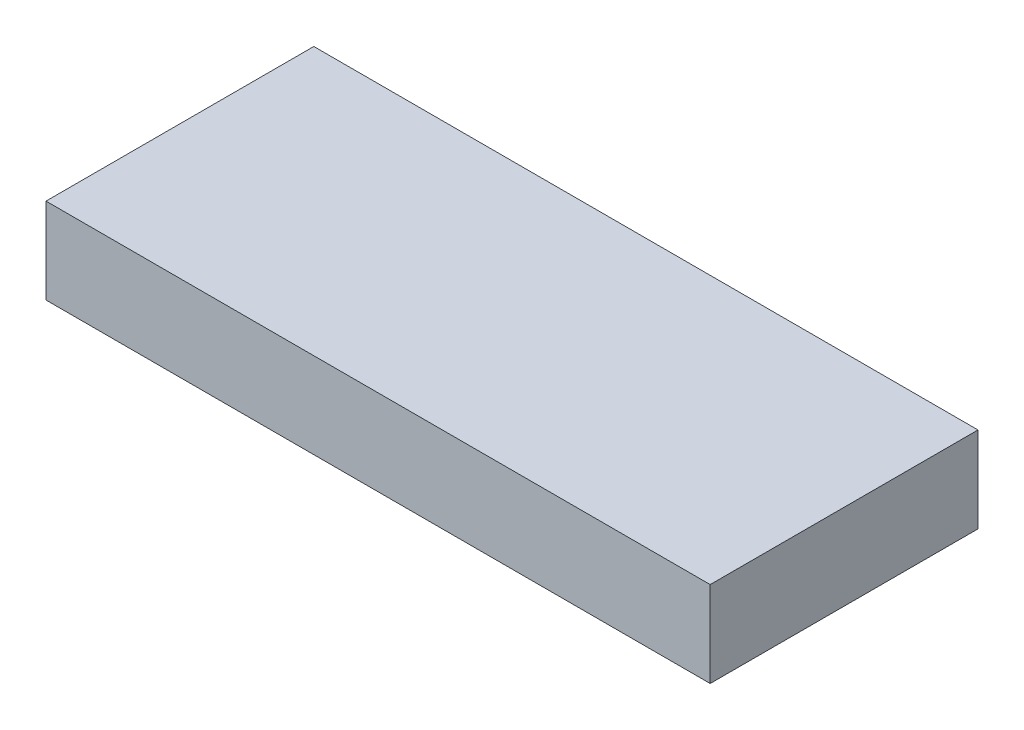
ISO-10303-21;
HEADER;
FILE_DESCRIPTION(('STEP AP214'),'2;1');
FILE_NAME('part.step','',(''),(''),'','','');
FILE_SCHEMA(('AUTOMOTIVE_DESIGN { 1 0 10303 214 1 1 1 1 }'));
ENDSEC;
DATA;
#1=APPLICATION_CONTEXT('core data for automotive mechanical design processes');
#2=APPLICATION_PROTOCOL_DEFINITION('international standard','automotive_design',2000,#1);
#3=PRODUCT_CONTEXT('',#1,'mechanical');
#4=PRODUCT('Part','Part','',(#3));
#5=PRODUCT_RELATED_PRODUCT_CATEGORY('part','',(#4));
#6=PRODUCT_DEFINITION_FORMATION('','',#4);
#7=PRODUCT_DEFINITION_CONTEXT('part definition',#1,'design');
#8=PRODUCT_DEFINITION('design','',#6,#7);
#9=PRODUCT_DEFINITION_SHAPE('','',#8);
#10=(LENGTH_UNIT() NAMED_UNIT(*) SI_UNIT(.MILLI.,.METRE.));
#11=(NAMED_UNIT(*) PLANE_ANGLE_UNIT() SI_UNIT($,.RADIAN.));
#12=(NAMED_UNIT(*) SI_UNIT($,.STERADIAN.) SOLID_ANGLE_UNIT());
#13=UNCERTAINTY_MEASURE_WITH_UNIT(LENGTH_MEASURE(1.E-05),#10,'distance_accuracy_value','');
#14=(GEOMETRIC_REPRESENTATION_CONTEXT(3) GLOBAL_UNCERTAINTY_ASSIGNED_CONTEXT((#13)) GLOBAL_UNIT_ASSIGNED_CONTEXT((#10,
#11,#12)) REPRESENTATION_CONTEXT('',''));
#15=CARTESIAN_POINT('',(0.,0.,0.));
#16=DIRECTION('',(0.,0.,1.));
#17=DIRECTION('',(1.,0.,0.));
#18=AXIS2_PLACEMENT_3D('',#15,#16,#17);
#19=CARTESIAN_POINT('',(46.5,12.,18.75));
#20=DIRECTION('',(-1.,0.,0.));
#21=DIRECTION('',(0.,0.,1.));
#22=AXIS2_PLACEMENT_3D('',#19,#20,#21);
#23=PLANE('',#22);
#24=DIRECTION('',(0.,0.,-1.));
#25=VECTOR('',#24,1.);
#26=CARTESIAN_POINT('',(46.5,0.,18.75));
#27=LINE('',#26,#25);
#28=CARTESIAN_POINT('',(46.5,0.,18.75));
#29=VERTEX_POINT('',#28);
#30=CARTESIAN_POINT('',(46.5,0.,-18.75));
#31=VERTEX_POINT('',#30);
#32=EDGE_CURVE('E95',#29,#31,#27,.T.);
#33=ORIENTED_EDGE('',*,*,#32,.T.);
#34=DIRECTION('',(0.,-1.,0.));
#35=VECTOR('',#34,1.);
#36=CARTESIAN_POINT('',(46.5,12.,-18.75));
#37=LINE('',#36,#35);
#38=CARTESIAN_POINT('',(46.5,12.,-18.75));
#39=VERTEX_POINT('',#38);
#40=EDGE_CURVE('E11',#39,#31,#37,.T.);
#41=ORIENTED_EDGE('',*,*,#40,.F.);
#42=DIRECTION('',(0.,0.,-1.));
#43=VECTOR('',#42,1.);
#44=CARTESIAN_POINT('',(46.5,12.,18.75));
#45=LINE('',#44,#43);
#46=CARTESIAN_POINT('',(46.5,12.,18.75));
#47=VERTEX_POINT('',#46);
#48=EDGE_CURVE('E83',#47,#39,#45,.T.);
#49=ORIENTED_EDGE('',*,*,#48,.F.);
#50=DIRECTION('',(0.,-1.,0.));
#51=VECTOR('',#50,1.);
#52=CARTESIAN_POINT('',(46.5,12.,18.75));
#53=LINE('',#52,#51);
#54=EDGE_CURVE('E91',#47,#29,#53,.T.);
#55=ORIENTED_EDGE('',*,*,#54,.T.);
#56=EDGE_LOOP('',(#33,#41,#49,#55));
#57=FACE_BOUND('',#56,.T.);
#58=ADVANCED_FACE('F32',(#57),#23,.F.);
#59=CARTESIAN_POINT('',(-46.5,12.,-18.75));
#60=DIRECTION('',(0.,0.,1.));
#61=DIRECTION('',(1.,0.,0.));
#62=AXIS2_PLACEMENT_3D('',#59,#60,#61);
#63=PLANE('',#62);
#64=DIRECTION('',(-1.,0.,0.));
#65=VECTOR('',#64,1.);
#66=CARTESIAN_POINT('',(-46.5,0.,-18.75));
#67=LINE('',#66,#65);
#68=CARTESIAN_POINT('',(-46.5,0.,-18.75));
#69=VERTEX_POINT('',#68);
#70=EDGE_CURVE('E87',#31,#69,#67,.T.);
#71=ORIENTED_EDGE('',*,*,#70,.T.);
#72=DIRECTION('',(0.,-1.,0.));
#73=VECTOR('',#72,1.);
#74=CARTESIAN_POINT('',(-46.5,12.,-18.75));
#75=LINE('',#74,#73);
#76=CARTESIAN_POINT('',(-46.5,12.,-18.75));
#77=VERTEX_POINT('',#76);
#78=EDGE_CURVE('E40',#77,#69,#75,.T.);
#79=ORIENTED_EDGE('',*,*,#78,.F.);
#80=DIRECTION('',(-1.,0.,0.));
#81=VECTOR('',#80,1.);
#82=CARTESIAN_POINT('',(-46.5,12.,-18.75));
#83=LINE('',#82,#81);
#84=EDGE_CURVE('E78',#39,#77,#83,.T.);
#85=ORIENTED_EDGE('',*,*,#84,.F.);
#86=ORIENTED_EDGE('',*,*,#40,.T.);
#87=EDGE_LOOP('',(#71,#79,#85,#86));
#88=FACE_BOUND('',#87,.T.);
#89=ADVANCED_FACE('F86',(#88),#63,.F.);
#90=CARTESIAN_POINT('',(-46.5,12.,18.75));
#91=DIRECTION('',(1.,0.,0.));
#92=DIRECTION('',(0.,0.,-1.));
#93=AXIS2_PLACEMENT_3D('',#90,#91,#92);
#94=PLANE('',#93);
#95=DIRECTION('',(0.,0.,1.));
#96=VECTOR('',#95,1.);
#97=CARTESIAN_POINT('',(-46.5,0.,18.75));
#98=LINE('',#97,#96);
#99=CARTESIAN_POINT('',(-46.5,0.,18.75));
#100=VERTEX_POINT('',#99);
#101=EDGE_CURVE('E65',#69,#100,#98,.T.);
#102=ORIENTED_EDGE('',*,*,#101,.T.);
#103=DIRECTION('',(0.,-1.,0.));
#104=VECTOR('',#103,1.);
#105=CARTESIAN_POINT('',(-46.5,12.,18.75));
#106=LINE('',#105,#104);
#107=CARTESIAN_POINT('',(-46.5,12.,18.75));
#108=VERTEX_POINT('',#107);
#109=EDGE_CURVE('E88',#108,#100,#106,.T.);
#110=ORIENTED_EDGE('',*,*,#109,.F.);
#111=DIRECTION('',(0.,0.,1.));
#112=VECTOR('',#111,1.);
#113=CARTESIAN_POINT('',(-46.5,12.,18.75));
#114=LINE('',#113,#112);
#115=EDGE_CURVE('E81',#77,#108,#114,.T.);
#116=ORIENTED_EDGE('',*,*,#115,.F.);
#117=ORIENTED_EDGE('',*,*,#78,.T.);
#118=EDGE_LOOP('',(#102,#110,#116,#117));
#119=FACE_BOUND('',#118,.T.);
#120=ADVANCED_FACE('F89',(#119),#94,.F.);
#121=CARTESIAN_POINT('',(-46.5,12.,18.75));
#122=DIRECTION('',(0.,0.,-1.));
#123=DIRECTION('',(-1.,0.,0.));
#124=AXIS2_PLACEMENT_3D('',#121,#122,#123);
#125=PLANE('',#124);
#126=DIRECTION('',(1.,0.,0.));
#127=VECTOR('',#126,1.);
#128=CARTESIAN_POINT('',(-46.5,0.,18.75));
#129=LINE('',#128,#127);
#130=EDGE_CURVE('E71',#100,#29,#129,.T.);
#131=ORIENTED_EDGE('',*,*,#130,.T.);
#132=ORIENTED_EDGE('',*,*,#54,.F.);
#133=DIRECTION('',(1.,0.,0.));
#134=VECTOR('',#133,1.);
#135=CARTESIAN_POINT('',(-46.5,12.,18.75));
#136=LINE('',#135,#134);
#137=EDGE_CURVE('E48',#108,#47,#136,.T.);
#138=ORIENTED_EDGE('',*,*,#137,.F.);
#139=ORIENTED_EDGE('',*,*,#109,.T.);
#140=EDGE_LOOP('',(#131,#132,#138,#139));
#141=FACE_BOUND('',#140,.T.);
#142=ADVANCED_FACE('F102',(#141),#125,.F.);
#143=CARTESIAN_POINT('',(0.,12.,0.));
#144=DIRECTION('',(0.,-1.,0.));
#145=DIRECTION('',(0.,0.,-1.));
#146=AXIS2_PLACEMENT_3D('',#143,#144,#145);
#147=PLANE('',#146);
#148=ORIENTED_EDGE('',*,*,#48,.T.);
#149=ORIENTED_EDGE('',*,*,#84,.T.);
#150=ORIENTED_EDGE('',*,*,#115,.T.);
#151=ORIENTED_EDGE('',*,*,#137,.T.);
#152=EDGE_LOOP('',(#148,#149,#150,#151));
#153=FACE_BOUND('',#152,.T.);
#154=ADVANCED_FACE('F79',(#153),#147,.F.);
#155=CARTESIAN_POINT('',(0.,0.,0.));
#156=DIRECTION('',(0.,-1.,0.));
#157=DIRECTION('',(0.,0.,-1.));
#158=AXIS2_PLACEMENT_3D('',#155,#156,#157);
#159=PLANE('',#158);
#160=ORIENTED_EDGE('',*,*,#32,.F.);
#161=ORIENTED_EDGE('',*,*,#130,.F.);
#162=ORIENTED_EDGE('',*,*,#101,.F.);
#163=ORIENTED_EDGE('',*,*,#70,.F.);
#164=EDGE_LOOP('',(#160,#161,#162,#163));
#165=FACE_BOUND('',#164,.T.);
#166=ADVANCED_FACE('F105',(#165),#159,.T.);
#167=CLOSED_SHELL('',(#58,#89,#120,#142,#154,#166));
#168=MANIFOLD_SOLID_BREP('B2',#167);
#169=ADVANCED_BREP_SHAPE_REPRESENTATION('',(#18,#168),#14);
#170=SHAPE_DEFINITION_REPRESENTATION(#9,#169);
ENDSEC;
END-ISO-10303-21;
